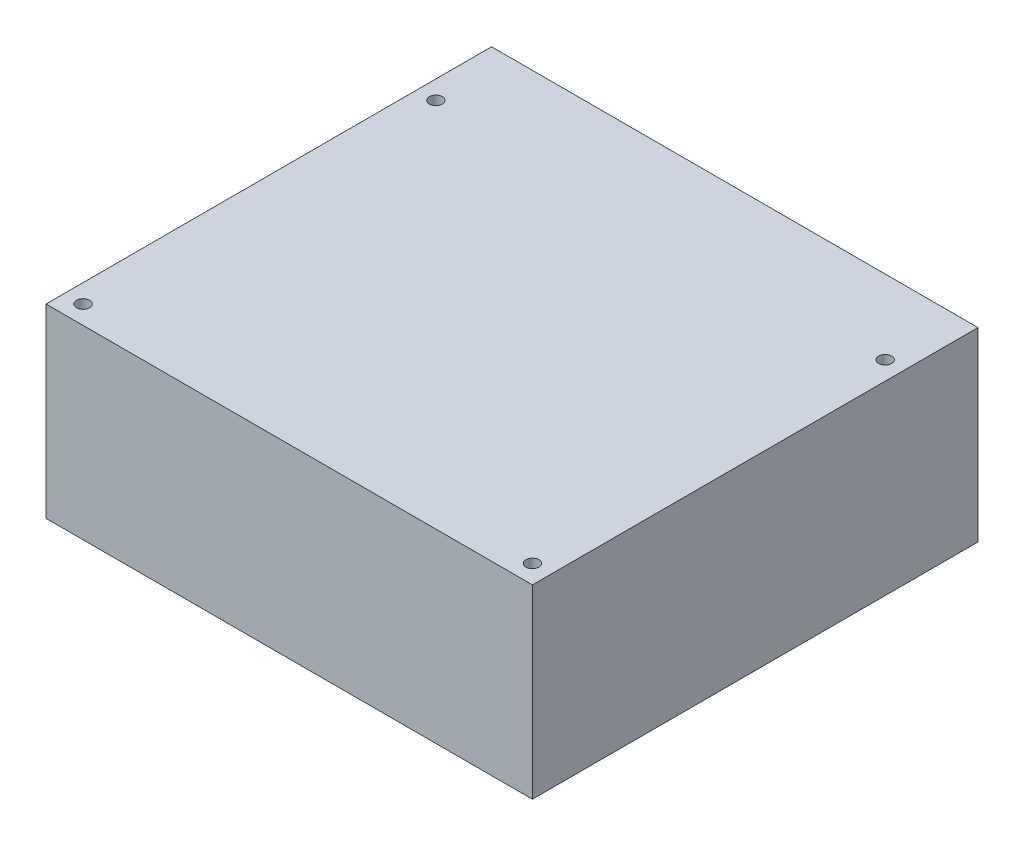
ISO-10303-21;
HEADER;
FILE_DESCRIPTION(('STEP AP214'),'2;1');
FILE_NAME('part.step','',(''),(''),'','','');
FILE_SCHEMA(('AUTOMOTIVE_DESIGN { 1 0 10303 214 1 1 1 1 }'));
ENDSEC;
DATA;
#1=APPLICATION_CONTEXT('core data for automotive mechanical design processes');
#2=APPLICATION_PROTOCOL_DEFINITION('international standard','automotive_design',2000,#1);
#3=PRODUCT_CONTEXT('',#1,'mechanical');
#4=PRODUCT('Part','Part','',(#3));
#5=PRODUCT_RELATED_PRODUCT_CATEGORY('part','',(#4));
#6=PRODUCT_DEFINITION_FORMATION('','',#4);
#7=PRODUCT_DEFINITION_CONTEXT('part definition',#1,'design');
#8=PRODUCT_DEFINITION('design','',#6,#7);
#9=PRODUCT_DEFINITION_SHAPE('','',#8);
#10=(LENGTH_UNIT() NAMED_UNIT(*) SI_UNIT(.MILLI.,.METRE.));
#11=(NAMED_UNIT(*) PLANE_ANGLE_UNIT() SI_UNIT($,.RADIAN.));
#12=(NAMED_UNIT(*) SI_UNIT($,.STERADIAN.) SOLID_ANGLE_UNIT());
#13=UNCERTAINTY_MEASURE_WITH_UNIT(LENGTH_MEASURE(1.E-05),#10,'distance_accuracy_value','');
#14=(GEOMETRIC_REPRESENTATION_CONTEXT(3) GLOBAL_UNCERTAINTY_ASSIGNED_CONTEXT((#13)) GLOBAL_UNIT_ASSIGNED_CONTEXT((#10,
#11,#12)) REPRESENTATION_CONTEXT('',''));
#15=CARTESIAN_POINT('',(0.,0.,0.));
#16=DIRECTION('',(0.,0.,1.));
#17=DIRECTION('',(1.,0.,0.));
#18=AXIS2_PLACEMENT_3D('',#15,#16,#17);
#19=CARTESIAN_POINT('',(0.,50.,0.));
#20=DIRECTION('',(0.,1.,0.));
#21=DIRECTION('',(0.,0.,1.));
#22=AXIS2_PLACEMENT_3D('',#19,#20,#21);
#23=PLANE('',#22);
#24=CARTESIAN_POINT('',(60.5,50.,-40.));
#25=DIRECTION('',(0.,1.,0.));
#26=DIRECTION('',(0.,0.,1.));
#27=AXIS2_PLACEMENT_3D('',#24,#25,#26);
#28=CIRCLE('',#27,1.75);
#29=CARTESIAN_POINT('',(60.5,50.,-38.25));
#30=VERTEX_POINT('',#29);
#31=EDGE_CURVE('E144',#30,#30,#28,.T.);
#32=ORIENTED_EDGE('',*,*,#31,.F.);
#33=EDGE_LOOP('',(#32));
#34=FACE_BOUND('',#33,.T.);
#35=CARTESIAN_POINT('',(-60.5,50.,55.));
#36=DIRECTION('',(0.,1.,0.));
#37=DIRECTION('',(0.,0.,1.));
#38=AXIS2_PLACEMENT_3D('',#35,#36,#37);
#39=CIRCLE('',#38,1.75);
#40=CARTESIAN_POINT('',(-60.5,50.,56.75));
#41=VERTEX_POINT('',#40);
#42=EDGE_CURVE('E114',#41,#41,#39,.T.);
#43=ORIENTED_EDGE('',*,*,#42,.F.);
#44=EDGE_LOOP('',(#43));
#45=FACE_BOUND('',#44,.T.);
#46=DIRECTION('',(0.,0.,-1.));
#47=VECTOR('',#46,1.);
#48=CARTESIAN_POINT('',(65.5,50.,-60.));
#49=LINE('',#48,#47);
#50=CARTESIAN_POINT('',(65.5,50.,60.));
#51=VERTEX_POINT('',#50);
#52=CARTESIAN_POINT('',(65.5,50.,-60.));
#53=VERTEX_POINT('',#52);
#54=EDGE_CURVE('E94',#51,#53,#49,.T.);
#55=ORIENTED_EDGE('',*,*,#54,.T.);
#56=DIRECTION('',(-1.,0.,0.));
#57=VECTOR('',#56,1.);
#58=CARTESIAN_POINT('',(-65.5,50.,-60.));
#59=LINE('',#58,#57);
#60=CARTESIAN_POINT('',(-65.5,50.,-60.));
#61=VERTEX_POINT('',#60);
#62=EDGE_CURVE('E89',#53,#61,#59,.T.);
#63=ORIENTED_EDGE('',*,*,#62,.T.);
#64=DIRECTION('',(0.,0.,1.));
#65=VECTOR('',#64,1.);
#66=CARTESIAN_POINT('',(-65.5,50.,-60.));
#67=LINE('',#66,#65);
#68=CARTESIAN_POINT('',(-65.5,50.,60.));
#69=VERTEX_POINT('',#68);
#70=EDGE_CURVE('E92',#61,#69,#67,.T.);
#71=ORIENTED_EDGE('',*,*,#70,.T.);
#72=DIRECTION('',(1.,0.,0.));
#73=VECTOR('',#72,1.);
#74=CARTESIAN_POINT('',(-65.5,50.,60.));
#75=LINE('',#74,#73);
#76=EDGE_CURVE('E59',#69,#51,#75,.T.);
#77=ORIENTED_EDGE('',*,*,#76,.T.);
#78=EDGE_LOOP('',(#55,#63,#71,#77));
#79=FACE_BOUND('',#78,.T.);
#80=CARTESIAN_POINT('',(60.5,50.,55.));
#81=DIRECTION('',(0.,1.,0.));
#82=DIRECTION('',(0.,0.,1.));
#83=AXIS2_PLACEMENT_3D('',#80,#81,#82);
#84=CIRCLE('',#83,1.75);
#85=CARTESIAN_POINT('',(60.5,50.,56.75));
#86=VERTEX_POINT('',#85);
#87=EDGE_CURVE('E136',#86,#86,#84,.T.);
#88=ORIENTED_EDGE('',*,*,#87,.F.);
#89=EDGE_LOOP('',(#88));
#90=FACE_BOUND('',#89,.T.);
#91=CARTESIAN_POINT('',(-60.5,50.,-40.));
#92=DIRECTION('',(0.,1.,0.));
#93=DIRECTION('',(0.,0.,1.));
#94=AXIS2_PLACEMENT_3D('',#91,#92,#93);
#95=CIRCLE('',#94,1.75);
#96=CARTESIAN_POINT('',(-60.5,50.,-38.25));
#97=VERTEX_POINT('',#96);
#98=EDGE_CURVE('E152',#97,#97,#95,.T.);
#99=ORIENTED_EDGE('',*,*,#98,.F.);
#100=EDGE_LOOP('',(#99));
#101=FACE_BOUND('',#100,.T.);
#102=ADVANCED_FACE('F41',(#34,#45,#79,#90,#101),#23,.T.);
#103=CARTESIAN_POINT('',(0.,0.,0.));
#104=DIRECTION('',(0.,1.,0.));
#105=DIRECTION('',(0.,0.,1.));
#106=AXIS2_PLACEMENT_3D('',#103,#104,#105);
#107=PLANE('',#106);
#108=DIRECTION('',(0.,0.,-1.));
#109=VECTOR('',#108,1.);
#110=CARTESIAN_POINT('',(65.5,0.,-60.));
#111=LINE('',#110,#109);
#112=CARTESIAN_POINT('',(65.5,0.,60.));
#113=VERTEX_POINT('',#112);
#114=CARTESIAN_POINT('',(65.5,0.,-60.));
#115=VERTEX_POINT('',#114);
#116=EDGE_CURVE('E110',#113,#115,#111,.T.);
#117=ORIENTED_EDGE('',*,*,#116,.F.);
#118=DIRECTION('',(1.,0.,0.));
#119=VECTOR('',#118,1.);
#120=CARTESIAN_POINT('',(-65.5,0.,60.));
#121=LINE('',#120,#119);
#122=CARTESIAN_POINT('',(-65.5,0.,60.));
#123=VERTEX_POINT('',#122);
#124=EDGE_CURVE('E82',#123,#113,#121,.T.);
#125=ORIENTED_EDGE('',*,*,#124,.F.);
#126=DIRECTION('',(0.,0.,1.));
#127=VECTOR('',#126,1.);
#128=CARTESIAN_POINT('',(-65.5,0.,-60.));
#129=LINE('',#128,#127);
#130=CARTESIAN_POINT('',(-65.5,0.,-60.));
#131=VERTEX_POINT('',#130);
#132=EDGE_CURVE('E76',#131,#123,#129,.T.);
#133=ORIENTED_EDGE('',*,*,#132,.F.);
#134=DIRECTION('',(-1.,0.,0.));
#135=VECTOR('',#134,1.);
#136=CARTESIAN_POINT('',(-65.5,0.,-60.));
#137=LINE('',#136,#135);
#138=EDGE_CURVE('E99',#115,#131,#137,.T.);
#139=ORIENTED_EDGE('',*,*,#138,.F.);
#140=EDGE_LOOP('',(#117,#125,#133,#139));
#141=FACE_BOUND('',#140,.T.);
#142=CARTESIAN_POINT('',(-60.5,0.,55.));
#143=DIRECTION('',(0.,1.,0.));
#144=DIRECTION('',(0.,0.,1.));
#145=AXIS2_PLACEMENT_3D('',#142,#143,#144);
#146=CIRCLE('',#145,1.75);
#147=CARTESIAN_POINT('',(-60.5,0.,56.75));
#148=VERTEX_POINT('',#147);
#149=EDGE_CURVE('E132',#148,#148,#146,.T.);
#150=ORIENTED_EDGE('',*,*,#149,.T.);
#151=EDGE_LOOP('',(#150));
#152=FACE_BOUND('',#151,.T.);
#153=CARTESIAN_POINT('',(60.5,0.,55.));
#154=DIRECTION('',(0.,1.,0.));
#155=DIRECTION('',(0.,0.,1.));
#156=AXIS2_PLACEMENT_3D('',#153,#154,#155);
#157=CIRCLE('',#156,1.75);
#158=CARTESIAN_POINT('',(60.5,0.,56.75));
#159=VERTEX_POINT('',#158);
#160=EDGE_CURVE('E140',#159,#159,#157,.T.);
#161=ORIENTED_EDGE('',*,*,#160,.T.);
#162=EDGE_LOOP('',(#161));
#163=FACE_BOUND('',#162,.T.);
#164=CARTESIAN_POINT('',(60.5,0.,-40.));
#165=DIRECTION('',(0.,1.,0.));
#166=DIRECTION('',(0.,0.,1.));
#167=AXIS2_PLACEMENT_3D('',#164,#165,#166);
#168=CIRCLE('',#167,1.75);
#169=CARTESIAN_POINT('',(60.5,0.,-38.25));
#170=VERTEX_POINT('',#169);
#171=EDGE_CURVE('E148',#170,#170,#168,.T.);
#172=ORIENTED_EDGE('',*,*,#171,.T.);
#173=EDGE_LOOP('',(#172));
#174=FACE_BOUND('',#173,.T.);
#175=CARTESIAN_POINT('',(-60.5,0.,-40.));
#176=DIRECTION('',(0.,1.,0.));
#177=DIRECTION('',(0.,0.,1.));
#178=AXIS2_PLACEMENT_3D('',#175,#176,#177);
#179=CIRCLE('',#178,1.75);
#180=CARTESIAN_POINT('',(-60.5,0.,-38.25));
#181=VERTEX_POINT('',#180);
#182=EDGE_CURVE('E156',#181,#181,#179,.T.);
#183=ORIENTED_EDGE('',*,*,#182,.T.);
#184=EDGE_LOOP('',(#183));
#185=FACE_BOUND('',#184,.T.);
#186=ADVANCED_FACE('F127',(#141,#152,#163,#174,#185),#107,.F.);
#187=CARTESIAN_POINT('',(65.5,50.,-60.));
#188=DIRECTION('',(-1.,0.,0.));
#189=DIRECTION('',(0.,0.,1.));
#190=AXIS2_PLACEMENT_3D('',#187,#188,#189);
#191=PLANE('',#190);
#192=ORIENTED_EDGE('',*,*,#116,.T.);
#193=DIRECTION('',(0.,-1.,0.));
#194=VECTOR('',#193,1.);
#195=CARTESIAN_POINT('',(65.5,50.,-60.));
#196=LINE('',#195,#194);
#197=EDGE_CURVE('E11',#53,#115,#196,.T.);
#198=ORIENTED_EDGE('',*,*,#197,.F.);
#199=ORIENTED_EDGE('',*,*,#54,.F.);
#200=DIRECTION('',(0.,-1.,0.));
#201=VECTOR('',#200,1.);
#202=CARTESIAN_POINT('',(65.5,50.,60.));
#203=LINE('',#202,#201);
#204=EDGE_CURVE('E106',#51,#113,#203,.T.);
#205=ORIENTED_EDGE('',*,*,#204,.T.);
#206=EDGE_LOOP('',(#192,#198,#199,#205));
#207=FACE_BOUND('',#206,.T.);
#208=ADVANCED_FACE('F43',(#207),#191,.F.);
#209=CARTESIAN_POINT('',(-65.5,50.,-60.));
#210=DIRECTION('',(0.,0.,1.));
#211=DIRECTION('',(1.,0.,0.));
#212=AXIS2_PLACEMENT_3D('',#209,#210,#211);
#213=PLANE('',#212);
#214=ORIENTED_EDGE('',*,*,#138,.T.);
#215=DIRECTION('',(0.,-1.,0.));
#216=VECTOR('',#215,1.);
#217=CARTESIAN_POINT('',(-65.5,50.,-60.));
#218=LINE('',#217,#216);
#219=EDGE_CURVE('E51',#61,#131,#218,.T.);
#220=ORIENTED_EDGE('',*,*,#219,.F.);
#221=ORIENTED_EDGE('',*,*,#62,.F.);
#222=ORIENTED_EDGE('',*,*,#197,.T.);
#223=EDGE_LOOP('',(#214,#220,#221,#222));
#224=FACE_BOUND('',#223,.T.);
#225=ADVANCED_FACE('F98',(#224),#213,.F.);
#226=CARTESIAN_POINT('',(-65.5,50.,-60.));
#227=DIRECTION('',(1.,0.,0.));
#228=DIRECTION('',(0.,0.,-1.));
#229=AXIS2_PLACEMENT_3D('',#226,#227,#228);
#230=PLANE('',#229);
#231=ORIENTED_EDGE('',*,*,#132,.T.);
#232=DIRECTION('',(0.,-1.,0.));
#233=VECTOR('',#232,1.);
#234=CARTESIAN_POINT('',(-65.5,50.,60.));
#235=LINE('',#234,#233);
#236=EDGE_CURVE('E101',#69,#123,#235,.T.);
#237=ORIENTED_EDGE('',*,*,#236,.F.);
#238=ORIENTED_EDGE('',*,*,#70,.F.);
#239=ORIENTED_EDGE('',*,*,#219,.T.);
#240=EDGE_LOOP('',(#231,#237,#238,#239));
#241=FACE_BOUND('',#240,.T.);
#242=ADVANCED_FACE('F102',(#241),#230,.F.);
#243=CARTESIAN_POINT('',(-65.5,50.,60.));
#244=DIRECTION('',(0.,0.,-1.));
#245=DIRECTION('',(-1.,0.,0.));
#246=AXIS2_PLACEMENT_3D('',#243,#244,#245);
#247=PLANE('',#246);
#248=ORIENTED_EDGE('',*,*,#124,.T.);
#249=ORIENTED_EDGE('',*,*,#204,.F.);
#250=ORIENTED_EDGE('',*,*,#76,.F.);
#251=ORIENTED_EDGE('',*,*,#236,.T.);
#252=EDGE_LOOP('',(#248,#249,#250,#251));
#253=FACE_BOUND('',#252,.T.);
#254=ADVANCED_FACE('F124',(#253),#247,.F.);
#255=CARTESIAN_POINT('',(-60.5,50.,55.));
#256=DIRECTION('',(0.,-1.,0.));
#257=DIRECTION('',(0.,0.,-1.));
#258=AXIS2_PLACEMENT_3D('',#255,#256,#257);
#259=CYLINDRICAL_SURFACE('',#258,1.75);
#260=ORIENTED_EDGE('',*,*,#42,.T.);
#261=EDGE_LOOP('',(#260));
#262=FACE_BOUND('',#261,.T.);
#263=ORIENTED_EDGE('',*,*,#149,.F.);
#264=EDGE_LOOP('',(#263));
#265=FACE_BOUND('',#264,.T.);
#266=ADVANCED_FACE('F177',(#262,#265),#259,.F.);
#267=CARTESIAN_POINT('',(60.5,50.,55.));
#268=DIRECTION('',(0.,-1.,0.));
#269=DIRECTION('',(0.,0.,-1.));
#270=AXIS2_PLACEMENT_3D('',#267,#268,#269);
#271=CYLINDRICAL_SURFACE('',#270,1.75);
#272=ORIENTED_EDGE('',*,*,#87,.T.);
#273=EDGE_LOOP('',(#272));
#274=FACE_BOUND('',#273,.T.);
#275=ORIENTED_EDGE('',*,*,#160,.F.);
#276=EDGE_LOOP('',(#275));
#277=FACE_BOUND('',#276,.T.);
#278=ADVANCED_FACE('F224',(#274,#277),#271,.F.);
#279=CARTESIAN_POINT('',(60.5,50.,-40.));
#280=DIRECTION('',(0.,-1.,0.));
#281=DIRECTION('',(0.,0.,-1.));
#282=AXIS2_PLACEMENT_3D('',#279,#280,#281);
#283=CYLINDRICAL_SURFACE('',#282,1.75);
#284=ORIENTED_EDGE('',*,*,#31,.T.);
#285=EDGE_LOOP('',(#284));
#286=FACE_BOUND('',#285,.T.);
#287=ORIENTED_EDGE('',*,*,#171,.F.);
#288=EDGE_LOOP('',(#287));
#289=FACE_BOUND('',#288,.T.);
#290=ADVANCED_FACE('F232',(#286,#289),#283,.F.);
#291=CARTESIAN_POINT('',(-60.5,50.,-40.));
#292=DIRECTION('',(0.,-1.,0.));
#293=DIRECTION('',(0.,0.,-1.));
#294=AXIS2_PLACEMENT_3D('',#291,#292,#293);
#295=CYLINDRICAL_SURFACE('',#294,1.75);
#296=ORIENTED_EDGE('',*,*,#98,.T.);
#297=EDGE_LOOP('',(#296));
#298=FACE_BOUND('',#297,.T.);
#299=ORIENTED_EDGE('',*,*,#182,.F.);
#300=EDGE_LOOP('',(#299));
#301=FACE_BOUND('',#300,.T.);
#302=ADVANCED_FACE('F164',(#298,#301),#295,.F.);
#303=CLOSED_SHELL('',(#102,#186,#208,#225,#242,#254,#266,#278,#290,#302));
#304=MANIFOLD_SOLID_BREP('B2',#303);
#305=ADVANCED_BREP_SHAPE_REPRESENTATION('',(#18,#304),#14);
#306=SHAPE_DEFINITION_REPRESENTATION(#9,#305);
ENDSEC;
END-ISO-10303-21;
